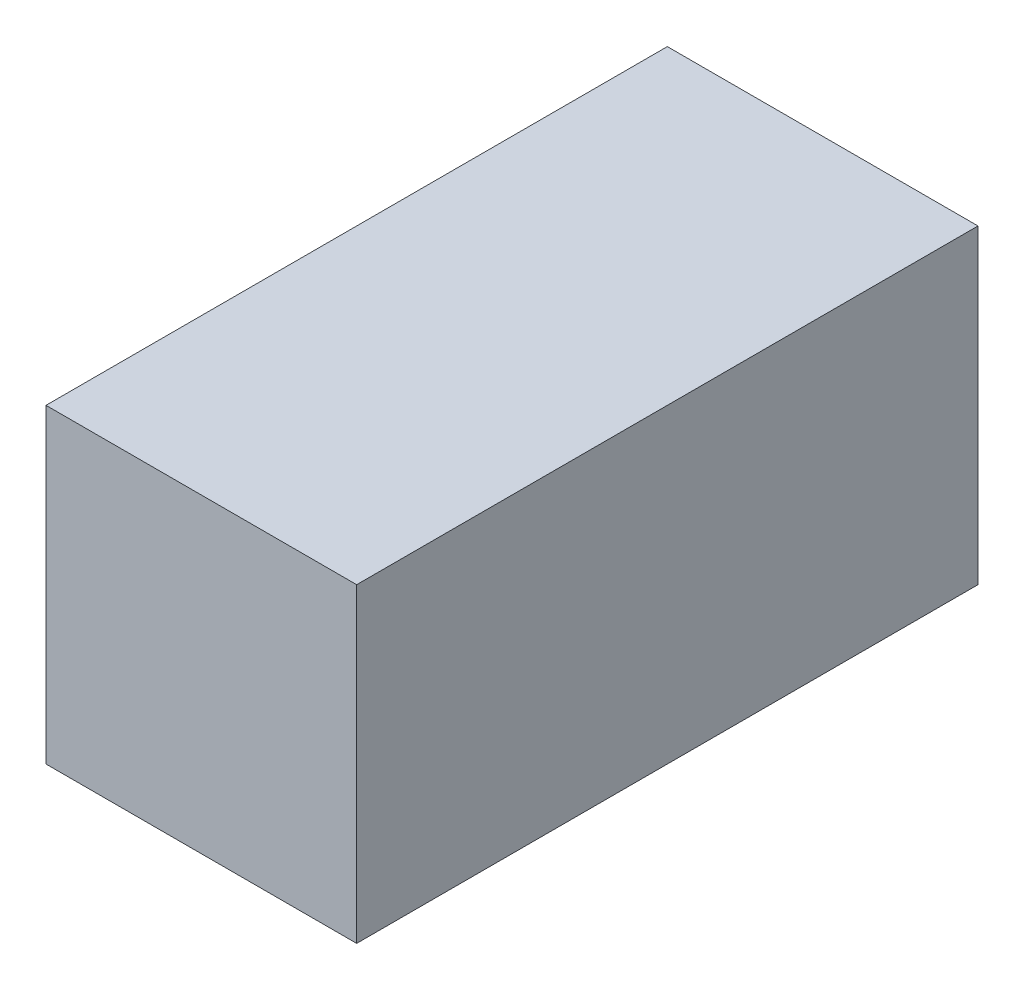
ISO-10303-21;
HEADER;
FILE_DESCRIPTION(('STEP AP214'),'2;1');
FILE_NAME('part.step','',(''),(''),'','','');
FILE_SCHEMA(('AUTOMOTIVE_DESIGN { 1 0 10303 214 1 1 1 1 }'));
ENDSEC;
DATA;
#1=APPLICATION_CONTEXT('core data for automotive mechanical design processes');
#2=APPLICATION_PROTOCOL_DEFINITION('international standard','automotive_design',2000,#1);
#3=PRODUCT_CONTEXT('',#1,'mechanical');
#4=PRODUCT('Part','Part','',(#3));
#5=PRODUCT_RELATED_PRODUCT_CATEGORY('part','',(#4));
#6=PRODUCT_DEFINITION_FORMATION('','',#4);
#7=PRODUCT_DEFINITION_CONTEXT('part definition',#1,'design');
#8=PRODUCT_DEFINITION('design','',#6,#7);
#9=PRODUCT_DEFINITION_SHAPE('','',#8);
#10=(LENGTH_UNIT() NAMED_UNIT(*) SI_UNIT(.MILLI.,.METRE.));
#11=(NAMED_UNIT(*) PLANE_ANGLE_UNIT() SI_UNIT($,.RADIAN.));
#12=(NAMED_UNIT(*) SI_UNIT($,.STERADIAN.) SOLID_ANGLE_UNIT());
#13=UNCERTAINTY_MEASURE_WITH_UNIT(LENGTH_MEASURE(1.E-05),#10,'distance_accuracy_value','');
#14=(GEOMETRIC_REPRESENTATION_CONTEXT(3) GLOBAL_UNCERTAINTY_ASSIGNED_CONTEXT((#13)) GLOBAL_UNIT_ASSIGNED_CONTEXT((#10,
#11,#12)) REPRESENTATION_CONTEXT('',''));
#15=CARTESIAN_POINT('',(0.,0.,0.));
#16=DIRECTION('',(0.,0.,1.));
#17=DIRECTION('',(1.,0.,0.));
#18=AXIS2_PLACEMENT_3D('',#15,#16,#17);
#19=CARTESIAN_POINT('',(-152.4,-152.4,609.6));
#20=DIRECTION('',(1.,0.,0.));
#21=DIRECTION('',(0.,0.,-1.));
#22=AXIS2_PLACEMENT_3D('',#19,#20,#21);
#23=PLANE('',#22);
#24=DIRECTION('',(0.,-1.,0.));
#25=VECTOR('',#24,1.);
#26=CARTESIAN_POINT('',(-152.4,-152.4,0.));
#27=LINE('',#26,#25);
#28=CARTESIAN_POINT('',(-152.4,152.4,0.));
#29=VERTEX_POINT('',#28);
#30=CARTESIAN_POINT('',(-152.4,-152.4,0.));
#31=VERTEX_POINT('',#30);
#32=EDGE_CURVE('E113',#29,#31,#27,.T.);
#33=ORIENTED_EDGE('',*,*,#32,.T.);
#34=DIRECTION('',(0.,0.,-1.));
#35=VECTOR('',#34,1.);
#36=CARTESIAN_POINT('',(-152.4,-152.4,609.6));
#37=LINE('',#36,#35);
#38=CARTESIAN_POINT('',(-152.4,-152.4,609.6));
#39=VERTEX_POINT('',#38);
#40=EDGE_CURVE('E11',#39,#31,#37,.T.);
#41=ORIENTED_EDGE('',*,*,#40,.F.);
#42=DIRECTION('',(0.,-1.,0.));
#43=VECTOR('',#42,1.);
#44=CARTESIAN_POINT('',(-152.4,-152.4,609.6));
#45=LINE('',#44,#43);
#46=CARTESIAN_POINT('',(-152.4,152.4,609.6));
#47=VERTEX_POINT('',#46);
#48=EDGE_CURVE('E97',#47,#39,#45,.T.);
#49=ORIENTED_EDGE('',*,*,#48,.F.);
#50=DIRECTION('',(0.,0.,-1.));
#51=VECTOR('',#50,1.);
#52=CARTESIAN_POINT('',(-152.4,152.4,609.6));
#53=LINE('',#52,#51);
#54=EDGE_CURVE('E109',#47,#29,#53,.T.);
#55=ORIENTED_EDGE('',*,*,#54,.T.);
#56=EDGE_LOOP('',(#33,#41,#49,#55));
#57=FACE_BOUND('',#56,.T.);
#58=ADVANCED_FACE('F45',(#57),#23,.F.);
#59=CARTESIAN_POINT('',(152.4,-152.4,609.6));
#60=DIRECTION('',(0.,1.,0.));
#61=DIRECTION('',(-1.,0.,0.));
#62=AXIS2_PLACEMENT_3D('',#59,#60,#61);
#63=PLANE('',#62);
#64=DIRECTION('',(1.,0.,0.));
#65=VECTOR('',#64,1.);
#66=CARTESIAN_POINT('',(152.4,-152.4,0.));
#67=LINE('',#66,#65);
#68=CARTESIAN_POINT('',(152.4,-152.4,0.));
#69=VERTEX_POINT('',#68);
#70=EDGE_CURVE('E102',#31,#69,#67,.T.);
#71=ORIENTED_EDGE('',*,*,#70,.T.);
#72=DIRECTION('',(0.,0.,-1.));
#73=VECTOR('',#72,1.);
#74=CARTESIAN_POINT('',(152.4,-152.4,609.6));
#75=LINE('',#74,#73);
#76=CARTESIAN_POINT('',(152.4,-152.4,609.6));
#77=VERTEX_POINT('',#76);
#78=EDGE_CURVE('E54',#77,#69,#75,.T.);
#79=ORIENTED_EDGE('',*,*,#78,.F.);
#80=DIRECTION('',(1.,0.,0.));
#81=VECTOR('',#80,1.);
#82=CARTESIAN_POINT('',(152.4,-152.4,609.6));
#83=LINE('',#82,#81);
#84=EDGE_CURVE('E92',#39,#77,#83,.T.);
#85=ORIENTED_EDGE('',*,*,#84,.F.);
#86=ORIENTED_EDGE('',*,*,#40,.T.);
#87=EDGE_LOOP('',(#71,#79,#85,#86));
#88=FACE_BOUND('',#87,.T.);
#89=ADVANCED_FACE('F101',(#88),#63,.F.);
#90=CARTESIAN_POINT('',(152.4,-152.4,609.6));
#91=DIRECTION('',(-1.,0.,0.));
#92=DIRECTION('',(0.,0.,1.));
#93=AXIS2_PLACEMENT_3D('',#90,#91,#92);
#94=PLANE('',#93);
#95=DIRECTION('',(0.,1.,0.));
#96=VECTOR('',#95,1.);
#97=CARTESIAN_POINT('',(152.4,-152.4,0.));
#98=LINE('',#97,#96);
#99=CARTESIAN_POINT('',(152.4,152.4,0.));
#100=VERTEX_POINT('',#99);
#101=EDGE_CURVE('E79',#69,#100,#98,.T.);
#102=ORIENTED_EDGE('',*,*,#101,.T.);
#103=DIRECTION('',(0.,0.,-1.));
#104=VECTOR('',#103,1.);
#105=CARTESIAN_POINT('',(152.4,152.4,609.6));
#106=LINE('',#105,#104);
#107=CARTESIAN_POINT('',(152.4,152.4,609.6));
#108=VERTEX_POINT('',#107);
#109=EDGE_CURVE('E104',#108,#100,#106,.T.);
#110=ORIENTED_EDGE('',*,*,#109,.F.);
#111=DIRECTION('',(0.,1.,0.));
#112=VECTOR('',#111,1.);
#113=CARTESIAN_POINT('',(152.4,-152.4,609.6));
#114=LINE('',#113,#112);
#115=EDGE_CURVE('E95',#77,#108,#114,.T.);
#116=ORIENTED_EDGE('',*,*,#115,.F.);
#117=ORIENTED_EDGE('',*,*,#78,.T.);
#118=EDGE_LOOP('',(#102,#110,#116,#117));
#119=FACE_BOUND('',#118,.T.);
#120=ADVANCED_FACE('F105',(#119),#94,.F.);
#121=CARTESIAN_POINT('',(152.4,152.4,609.6));
#122=DIRECTION('',(0.,-1.,0.));
#123=DIRECTION('',(1.,0.,0.));
#124=AXIS2_PLACEMENT_3D('',#121,#122,#123);
#125=PLANE('',#124);
#126=DIRECTION('',(-1.,0.,0.));
#127=VECTOR('',#126,1.);
#128=CARTESIAN_POINT('',(152.4,152.4,0.));
#129=LINE('',#128,#127);
#130=EDGE_CURVE('E85',#100,#29,#129,.T.);
#131=ORIENTED_EDGE('',*,*,#130,.T.);
#132=ORIENTED_EDGE('',*,*,#54,.F.);
#133=DIRECTION('',(-1.,0.,0.));
#134=VECTOR('',#133,1.);
#135=CARTESIAN_POINT('',(152.4,152.4,609.6));
#136=LINE('',#135,#134);
#137=EDGE_CURVE('E62',#108,#47,#136,.T.);
#138=ORIENTED_EDGE('',*,*,#137,.F.);
#139=ORIENTED_EDGE('',*,*,#109,.T.);
#140=EDGE_LOOP('',(#131,#132,#138,#139));
#141=FACE_BOUND('',#140,.T.);
#142=ADVANCED_FACE('F126',(#141),#125,.F.);
#143=CARTESIAN_POINT('',(0.,0.,609.6));
#144=DIRECTION('',(0.,0.,1.));
#145=DIRECTION('',(1.,0.,0.));
#146=AXIS2_PLACEMENT_3D('',#143,#144,#145);
#147=PLANE('',#146);
#148=ORIENTED_EDGE('',*,*,#48,.T.);
#149=ORIENTED_EDGE('',*,*,#84,.T.);
#150=ORIENTED_EDGE('',*,*,#115,.T.);
#151=ORIENTED_EDGE('',*,*,#137,.T.);
#152=EDGE_LOOP('',(#148,#149,#150,#151));
#153=FACE_BOUND('',#152,.T.);
#154=ADVANCED_FACE('F93',(#153),#147,.T.);
#155=CARTESIAN_POINT('',(0.,0.,0.));
#156=DIRECTION('',(0.,0.,1.));
#157=DIRECTION('',(1.,0.,0.));
#158=AXIS2_PLACEMENT_3D('',#155,#156,#157);
#159=PLANE('',#158);
#160=ORIENTED_EDGE('',*,*,#32,.F.);
#161=ORIENTED_EDGE('',*,*,#130,.F.);
#162=ORIENTED_EDGE('',*,*,#101,.F.);
#163=ORIENTED_EDGE('',*,*,#70,.F.);
#164=EDGE_LOOP('',(#160,#161,#162,#163));
#165=FACE_BOUND('',#164,.T.);
#166=ADVANCED_FACE('F129',(#165),#159,.F.);
#167=CLOSED_SHELL('',(#58,#89,#120,#142,#154,#166));
#168=MANIFOLD_SOLID_BREP('B2',#167);
#169=ADVANCED_BREP_SHAPE_REPRESENTATION('',(#18,#168),#14);
#170=SHAPE_DEFINITION_REPRESENTATION(#9,#169);
ENDSEC;
END-ISO-10303-21;
